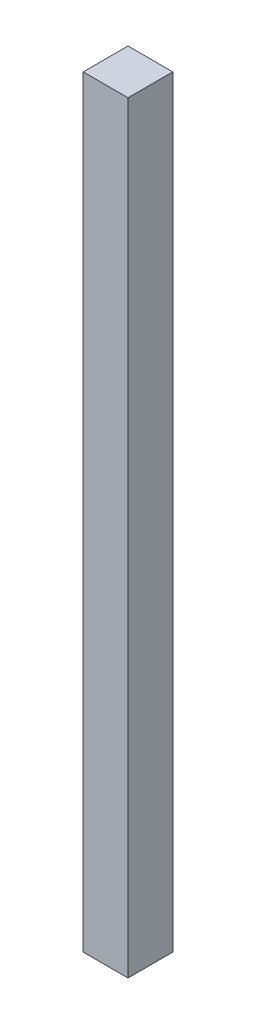
ISO-10303-21;
HEADER;
FILE_DESCRIPTION(('STEP AP214'),'2;1');
FILE_NAME('part.step','',(''),(''),'','','');
FILE_SCHEMA(('AUTOMOTIVE_DESIGN { 1 0 10303 214 1 1 1 1 }'));
ENDSEC;
DATA;
#1=APPLICATION_CONTEXT('core data for automotive mechanical design processes');
#2=APPLICATION_PROTOCOL_DEFINITION('international standard','automotive_design',2000,#1);
#3=PRODUCT_CONTEXT('',#1,'mechanical');
#4=PRODUCT('Part','Part','',(#3));
#5=PRODUCT_RELATED_PRODUCT_CATEGORY('part','',(#4));
#6=PRODUCT_DEFINITION_FORMATION('','',#4);
#7=PRODUCT_DEFINITION_CONTEXT('part definition',#1,'design');
#8=PRODUCT_DEFINITION('design','',#6,#7);
#9=PRODUCT_DEFINITION_SHAPE('','',#8);
#10=(LENGTH_UNIT() NAMED_UNIT(*) SI_UNIT(.MILLI.,.METRE.));
#11=(NAMED_UNIT(*) PLANE_ANGLE_UNIT() SI_UNIT($,.RADIAN.));
#12=(NAMED_UNIT(*) SI_UNIT($,.STERADIAN.) SOLID_ANGLE_UNIT());
#13=UNCERTAINTY_MEASURE_WITH_UNIT(LENGTH_MEASURE(1.E-05),#10,'distance_accuracy_value','');
#14=(GEOMETRIC_REPRESENTATION_CONTEXT(3) GLOBAL_UNCERTAINTY_ASSIGNED_CONTEXT((#13)) GLOBAL_UNIT_ASSIGNED_CONTEXT((#10,
#11,#12)) REPRESENTATION_CONTEXT('',''));
#15=CARTESIAN_POINT('',(0.,0.,0.));
#16=DIRECTION('',(0.,0.,1.));
#17=DIRECTION('',(1.,0.,0.));
#18=AXIS2_PLACEMENT_3D('',#15,#16,#17);
#19=CARTESIAN_POINT('',(50.,1700.,-50.));
#20=DIRECTION('',(-1.,0.,0.));
#21=DIRECTION('',(0.,0.,1.));
#22=AXIS2_PLACEMENT_3D('',#19,#20,#21);
#23=PLANE('',#22);
#24=DIRECTION('',(0.,0.,-1.));
#25=VECTOR('',#24,1.);
#26=CARTESIAN_POINT('',(50.,0.,-50.));
#27=LINE('',#26,#25);
#28=CARTESIAN_POINT('',(50.,0.,50.));
#29=VERTEX_POINT('',#28);
#30=CARTESIAN_POINT('',(50.,0.,-50.));
#31=VERTEX_POINT('',#30);
#32=EDGE_CURVE('E99',#29,#31,#27,.T.);
#33=ORIENTED_EDGE('',*,*,#32,.T.);
#34=DIRECTION('',(0.,-1.,0.));
#35=VECTOR('',#34,1.);
#36=CARTESIAN_POINT('',(50.,1700.,-50.));
#37=LINE('',#36,#35);
#38=CARTESIAN_POINT('',(50.,1700.,-50.));
#39=VERTEX_POINT('',#38);
#40=EDGE_CURVE('E11',#39,#31,#37,.T.);
#41=ORIENTED_EDGE('',*,*,#40,.F.);
#42=DIRECTION('',(0.,0.,-1.));
#43=VECTOR('',#42,1.);
#44=CARTESIAN_POINT('',(50.,1700.,-50.));
#45=LINE('',#44,#43);
#46=CARTESIAN_POINT('',(50.,1700.,50.));
#47=VERTEX_POINT('',#46);
#48=EDGE_CURVE('E87',#47,#39,#45,.T.);
#49=ORIENTED_EDGE('',*,*,#48,.F.);
#50=DIRECTION('',(0.,-1.,0.));
#51=VECTOR('',#50,1.);
#52=CARTESIAN_POINT('',(50.,1700.,50.));
#53=LINE('',#52,#51);
#54=EDGE_CURVE('E95',#47,#29,#53,.T.);
#55=ORIENTED_EDGE('',*,*,#54,.T.);
#56=EDGE_LOOP('',(#33,#41,#49,#55));
#57=FACE_BOUND('',#56,.T.);
#58=ADVANCED_FACE('F36',(#57),#23,.F.);
#59=CARTESIAN_POINT('',(-50.,1700.,-50.));
#60=DIRECTION('',(0.,0.,1.));
#61=DIRECTION('',(1.,0.,0.));
#62=AXIS2_PLACEMENT_3D('',#59,#60,#61);
#63=PLANE('',#62);
#64=DIRECTION('',(-1.,0.,0.));
#65=VECTOR('',#64,1.);
#66=CARTESIAN_POINT('',(-50.,0.,-50.));
#67=LINE('',#66,#65);
#68=CARTESIAN_POINT('',(-50.,0.,-50.));
#69=VERTEX_POINT('',#68);
#70=EDGE_CURVE('E91',#31,#69,#67,.T.);
#71=ORIENTED_EDGE('',*,*,#70,.T.);
#72=DIRECTION('',(0.,-1.,0.));
#73=VECTOR('',#72,1.);
#74=CARTESIAN_POINT('',(-50.,1700.,-50.));
#75=LINE('',#74,#73);
#76=CARTESIAN_POINT('',(-50.,1700.,-50.));
#77=VERTEX_POINT('',#76);
#78=EDGE_CURVE('E44',#77,#69,#75,.T.);
#79=ORIENTED_EDGE('',*,*,#78,.F.);
#80=DIRECTION('',(-1.,0.,0.));
#81=VECTOR('',#80,1.);
#82=CARTESIAN_POINT('',(-50.,1700.,-50.));
#83=LINE('',#82,#81);
#84=EDGE_CURVE('E82',#39,#77,#83,.T.);
#85=ORIENTED_EDGE('',*,*,#84,.F.);
#86=ORIENTED_EDGE('',*,*,#40,.T.);
#87=EDGE_LOOP('',(#71,#79,#85,#86));
#88=FACE_BOUND('',#87,.T.);
#89=ADVANCED_FACE('F90',(#88),#63,.F.);
#90=CARTESIAN_POINT('',(-50.,1700.,-50.));
#91=DIRECTION('',(1.,0.,0.));
#92=DIRECTION('',(0.,0.,-1.));
#93=AXIS2_PLACEMENT_3D('',#90,#91,#92);
#94=PLANE('',#93);
#95=DIRECTION('',(0.,0.,1.));
#96=VECTOR('',#95,1.);
#97=CARTESIAN_POINT('',(-50.,0.,-50.));
#98=LINE('',#97,#96);
#99=CARTESIAN_POINT('',(-50.,0.,50.));
#100=VERTEX_POINT('',#99);
#101=EDGE_CURVE('E69',#69,#100,#98,.T.);
#102=ORIENTED_EDGE('',*,*,#101,.T.);
#103=DIRECTION('',(0.,-1.,0.));
#104=VECTOR('',#103,1.);
#105=CARTESIAN_POINT('',(-50.,1700.,50.));
#106=LINE('',#105,#104);
#107=CARTESIAN_POINT('',(-50.,1700.,50.));
#108=VERTEX_POINT('',#107);
#109=EDGE_CURVE('E92',#108,#100,#106,.T.);
#110=ORIENTED_EDGE('',*,*,#109,.F.);
#111=DIRECTION('',(0.,0.,1.));
#112=VECTOR('',#111,1.);
#113=CARTESIAN_POINT('',(-50.,1700.,-50.));
#114=LINE('',#113,#112);
#115=EDGE_CURVE('E85',#77,#108,#114,.T.);
#116=ORIENTED_EDGE('',*,*,#115,.F.);
#117=ORIENTED_EDGE('',*,*,#78,.T.);
#118=EDGE_LOOP('',(#102,#110,#116,#117));
#119=FACE_BOUND('',#118,.T.);
#120=ADVANCED_FACE('F93',(#119),#94,.F.);
#121=CARTESIAN_POINT('',(-50.,1700.,50.));
#122=DIRECTION('',(0.,0.,-1.));
#123=DIRECTION('',(-1.,0.,0.));
#124=AXIS2_PLACEMENT_3D('',#121,#122,#123);
#125=PLANE('',#124);
#126=DIRECTION('',(1.,0.,0.));
#127=VECTOR('',#126,1.);
#128=CARTESIAN_POINT('',(-50.,0.,50.));
#129=LINE('',#128,#127);
#130=EDGE_CURVE('E75',#100,#29,#129,.T.);
#131=ORIENTED_EDGE('',*,*,#130,.T.);
#132=ORIENTED_EDGE('',*,*,#54,.F.);
#133=DIRECTION('',(1.,0.,0.));
#134=VECTOR('',#133,1.);
#135=CARTESIAN_POINT('',(-50.,1700.,50.));
#136=LINE('',#135,#134);
#137=EDGE_CURVE('E52',#108,#47,#136,.T.);
#138=ORIENTED_EDGE('',*,*,#137,.F.);
#139=ORIENTED_EDGE('',*,*,#109,.T.);
#140=EDGE_LOOP('',(#131,#132,#138,#139));
#141=FACE_BOUND('',#140,.T.);
#142=ADVANCED_FACE('F106',(#141),#125,.F.);
#143=CARTESIAN_POINT('',(0.,1700.,0.));
#144=DIRECTION('',(0.,1.,0.));
#145=DIRECTION('',(0.,0.,1.));
#146=AXIS2_PLACEMENT_3D('',#143,#144,#145);
#147=PLANE('',#146);
#148=ORIENTED_EDGE('',*,*,#48,.T.);
#149=ORIENTED_EDGE('',*,*,#84,.T.);
#150=ORIENTED_EDGE('',*,*,#115,.T.);
#151=ORIENTED_EDGE('',*,*,#137,.T.);
#152=EDGE_LOOP('',(#148,#149,#150,#151));
#153=FACE_BOUND('',#152,.T.);
#154=ADVANCED_FACE('F83',(#153),#147,.T.);
#155=CARTESIAN_POINT('',(0.,0.,0.));
#156=DIRECTION('',(0.,1.,0.));
#157=DIRECTION('',(0.,0.,1.));
#158=AXIS2_PLACEMENT_3D('',#155,#156,#157);
#159=PLANE('',#158);
#160=ORIENTED_EDGE('',*,*,#32,.F.);
#161=ORIENTED_EDGE('',*,*,#130,.F.);
#162=ORIENTED_EDGE('',*,*,#101,.F.);
#163=ORIENTED_EDGE('',*,*,#70,.F.);
#164=EDGE_LOOP('',(#160,#161,#162,#163));
#165=FACE_BOUND('',#164,.T.);
#166=ADVANCED_FACE('F109',(#165),#159,.F.);
#167=CLOSED_SHELL('',(#58,#89,#120,#142,#154,#166));
#168=MANIFOLD_SOLID_BREP('B2',#167);
#169=ADVANCED_BREP_SHAPE_REPRESENTATION('',(#18,#168),#14);
#170=SHAPE_DEFINITION_REPRESENTATION(#9,#169);
ENDSEC;
END-ISO-10303-21;
